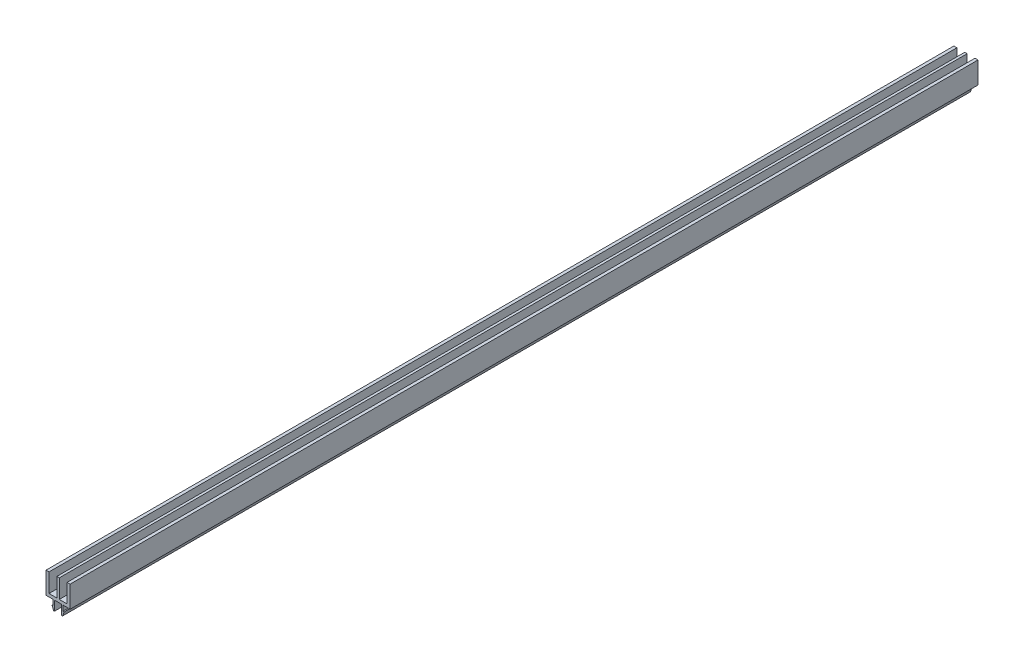
ISO-10303-21;
HEADER;
FILE_DESCRIPTION(('STEP AP214'),'2;1');
FILE_NAME('part.step','',(''),(''),'','','');
FILE_SCHEMA(('AUTOMOTIVE_DESIGN { 1 0 10303 214 1 1 1 1 }'));
ENDSEC;
DATA;
#1=APPLICATION_CONTEXT('core data for automotive mechanical design processes');
#2=APPLICATION_PROTOCOL_DEFINITION('international standard','automotive_design',2000,#1);
#3=PRODUCT_CONTEXT('',#1,'mechanical');
#4=PRODUCT('Part','Part','',(#3));
#5=PRODUCT_RELATED_PRODUCT_CATEGORY('part','',(#4));
#6=PRODUCT_DEFINITION_FORMATION('','',#4);
#7=PRODUCT_DEFINITION_CONTEXT('part definition',#1,'design');
#8=PRODUCT_DEFINITION('design','',#6,#7);
#9=PRODUCT_DEFINITION_SHAPE('','',#8);
#10=(LENGTH_UNIT() NAMED_UNIT(*) SI_UNIT(.MILLI.,.METRE.));
#11=(NAMED_UNIT(*) PLANE_ANGLE_UNIT() SI_UNIT($,.RADIAN.));
#12=(NAMED_UNIT(*) SI_UNIT($,.STERADIAN.) SOLID_ANGLE_UNIT());
#13=UNCERTAINTY_MEASURE_WITH_UNIT(LENGTH_MEASURE(1.E-05),#10,'distance_accuracy_value','');
#14=(GEOMETRIC_REPRESENTATION_CONTEXT(3) GLOBAL_UNCERTAINTY_ASSIGNED_CONTEXT((#13)) GLOBAL_UNIT_ASSIGNED_CONTEXT((#10,
#11,#12)) REPRESENTATION_CONTEXT('',''));
#15=CARTESIAN_POINT('',(0.,0.,0.));
#16=DIRECTION('',(0.,0.,1.));
#17=DIRECTION('',(1.,0.,0.));
#18=AXIS2_PLACEMENT_3D('',#15,#16,#17);
#19=CARTESIAN_POINT('',(-1.,17.9999999975,-702.));
#20=DIRECTION('',(-1.,0.,0.));
#21=DIRECTION('',(0.,-1.,0.));
#22=AXIS2_PLACEMENT_3D('',#19,#20,#21);
#23=PLANE('',#22);
#24=DIRECTION('',(0.,-1.,0.));
#25=VECTOR('',#24,1.);
#26=CARTESIAN_POINT('',(-1.,17.9999999975,50.));
#27=LINE('',#26,#25);
#28=CARTESIAN_POINT('',(-1.,17.9999999975,50.));
#29=VERTEX_POINT('',#28);
#30=CARTESIAN_POINT('',(-1.,2.4999999995,50.));
#31=VERTEX_POINT('',#30);
#32=EDGE_CURVE('E226',#29,#31,#27,.T.);
#33=ORIENTED_EDGE('',*,*,#32,.F.);
#34=DIRECTION('',(0.,0.,1.));
#35=VECTOR('',#34,1.);
#36=CARTESIAN_POINT('',(-1.,17.9999999975,-702.));
#37=LINE('',#36,#35);
#38=CARTESIAN_POINT('',(-1.,17.9999999975,-702.));
#39=VERTEX_POINT('',#38);
#40=EDGE_CURVE('E11',#39,#29,#37,.T.);
#41=ORIENTED_EDGE('',*,*,#40,.F.);
#42=DIRECTION('',(0.,-1.,0.));
#43=VECTOR('',#42,1.);
#44=CARTESIAN_POINT('',(-1.,17.9999999975,-702.));
#45=LINE('',#44,#43);
#46=CARTESIAN_POINT('',(-1.,2.4999999995,-702.));
#47=VERTEX_POINT('',#46);
#48=EDGE_CURVE('E294',#39,#47,#45,.T.);
#49=ORIENTED_EDGE('',*,*,#48,.T.);
#50=DIRECTION('',(0.,0.,1.));
#51=VECTOR('',#50,1.);
#52=CARTESIAN_POINT('',(-1.,2.4999999995,-702.));
#53=LINE('',#52,#51);
#54=EDGE_CURVE('E36',#47,#31,#53,.T.);
#55=ORIENTED_EDGE('',*,*,#54,.T.);
#56=EDGE_LOOP('',(#33,#41,#49,#55));
#57=FACE_BOUND('',#56,.T.);
#58=ADVANCED_FACE('F33',(#57),#23,.T.);
#59=CARTESIAN_POINT('',(0.999999999999998,17.9999999975,-702.));
#60=DIRECTION('',(0.,1.,0.));
#61=DIRECTION('',(0.,0.,1.));
#62=AXIS2_PLACEMENT_3D('',#59,#60,#61);
#63=PLANE('',#62);
#64=DIRECTION('',(-1.,0.,0.));
#65=VECTOR('',#64,1.);
#66=CARTESIAN_POINT('',(0.999999999999998,17.9999999975,50.));
#67=LINE('',#66,#65);
#68=CARTESIAN_POINT('',(0.999999999999998,17.9999999975,50.));
#69=VERTEX_POINT('',#68);
#70=EDGE_CURVE('E292',#69,#29,#67,.T.);
#71=ORIENTED_EDGE('',*,*,#70,.F.);
#72=DIRECTION('',(0.,0.,1.));
#73=VECTOR('',#72,1.);
#74=CARTESIAN_POINT('',(0.999999999999998,17.9999999975,-702.));
#75=LINE('',#74,#73);
#76=CARTESIAN_POINT('',(0.999999999999998,17.9999999975,-702.));
#77=VERTEX_POINT('',#76);
#78=EDGE_CURVE('E42',#77,#69,#75,.T.);
#79=ORIENTED_EDGE('',*,*,#78,.F.);
#80=DIRECTION('',(-1.,0.,0.));
#81=VECTOR('',#80,1.);
#82=CARTESIAN_POINT('',(0.999999999999998,17.9999999975,-702.));
#83=LINE('',#82,#81);
#84=EDGE_CURVE('E216',#77,#39,#83,.T.);
#85=ORIENTED_EDGE('',*,*,#84,.T.);
#86=ORIENTED_EDGE('',*,*,#40,.T.);
#87=EDGE_LOOP('',(#71,#79,#85,#86));
#88=FACE_BOUND('',#87,.T.);
#89=ADVANCED_FACE('F338',(#88),#63,.T.);
#90=CARTESIAN_POINT('',(0.999999999999998,2.4999999995,-702.));
#91=DIRECTION('',(1.,0.,0.));
#92=DIRECTION('',(0.,0.,-1.));
#93=AXIS2_PLACEMENT_3D('',#90,#91,#92);
#94=PLANE('',#93);
#95=DIRECTION('',(0.,1.,0.));
#96=VECTOR('',#95,1.);
#97=CARTESIAN_POINT('',(0.999999999999998,2.4999999995,50.));
#98=LINE('',#97,#96);
#99=CARTESIAN_POINT('',(0.999999999999998,2.4999999995,50.));
#100=VERTEX_POINT('',#99);
#101=EDGE_CURVE('E203',#100,#69,#98,.T.);
#102=ORIENTED_EDGE('',*,*,#101,.F.);
#103=DIRECTION('',(0.,0.,1.));
#104=VECTOR('',#103,1.);
#105=CARTESIAN_POINT('',(0.999999999999998,2.4999999995,-702.));
#106=LINE('',#105,#104);
#107=CARTESIAN_POINT('',(0.999999999999998,2.4999999995,-702.));
#108=VERTEX_POINT('',#107);
#109=EDGE_CURVE('E198',#108,#100,#106,.T.);
#110=ORIENTED_EDGE('',*,*,#109,.F.);
#111=DIRECTION('',(0.,1.,0.));
#112=VECTOR('',#111,1.);
#113=CARTESIAN_POINT('',(0.999999999999998,2.4999999995,-702.));
#114=LINE('',#113,#112);
#115=EDGE_CURVE('E201',#108,#77,#114,.T.);
#116=ORIENTED_EDGE('',*,*,#115,.T.);
#117=ORIENTED_EDGE('',*,*,#78,.T.);
#118=EDGE_LOOP('',(#102,#110,#116,#117));
#119=FACE_BOUND('',#118,.T.);
#120=ADVANCED_FACE('F200',(#119),#94,.T.);
#121=CARTESIAN_POINT('',(7.5,2.4999999995,-702.));
#122=DIRECTION('',(0.,1.,0.));
#123=DIRECTION('',(-1.,0.,0.));
#124=AXIS2_PLACEMENT_3D('',#121,#122,#123);
#125=PLANE('',#124);
#126=DIRECTION('',(-1.,0.,0.));
#127=VECTOR('',#126,1.);
#128=CARTESIAN_POINT('',(7.5,2.4999999995,50.));
#129=LINE('',#128,#127);
#130=CARTESIAN_POINT('',(7.5,2.4999999995,50.));
#131=VERTEX_POINT('',#130);
#132=EDGE_CURVE('E289',#131,#100,#129,.T.);
#133=ORIENTED_EDGE('',*,*,#132,.F.);
#134=DIRECTION('',(0.,0.,1.));
#135=VECTOR('',#134,1.);
#136=CARTESIAN_POINT('',(7.5,2.4999999995,-702.));
#137=LINE('',#136,#135);
#138=CARTESIAN_POINT('',(7.5,2.4999999995,-702.));
#139=VERTEX_POINT('',#138);
#140=EDGE_CURVE('E208',#139,#131,#137,.T.);
#141=ORIENTED_EDGE('',*,*,#140,.F.);
#142=DIRECTION('',(-1.,0.,0.));
#143=VECTOR('',#142,1.);
#144=CARTESIAN_POINT('',(7.5,2.4999999995,-702.));
#145=LINE('',#144,#143);
#146=EDGE_CURVE('E214',#139,#108,#145,.T.);
#147=ORIENTED_EDGE('',*,*,#146,.T.);
#148=ORIENTED_EDGE('',*,*,#109,.T.);
#149=EDGE_LOOP('',(#133,#141,#147,#148));
#150=FACE_BOUND('',#149,.T.);
#151=ADVANCED_FACE('F218',(#150),#125,.T.);
#152=CARTESIAN_POINT('',(7.5,17.9999999975,-702.));
#153=DIRECTION('',(-1.,0.,0.));
#154=DIRECTION('',(0.,-1.,0.));
#155=AXIS2_PLACEMENT_3D('',#152,#153,#154);
#156=PLANE('',#155);
#157=DIRECTION('',(0.,-1.,0.));
#158=VECTOR('',#157,1.);
#159=CARTESIAN_POINT('',(7.5,17.9999999975,50.));
#160=LINE('',#159,#158);
#161=CARTESIAN_POINT('',(7.5,17.9999999975,50.));
#162=VERTEX_POINT('',#161);
#163=EDGE_CURVE('E286',#162,#131,#160,.T.);
#164=ORIENTED_EDGE('',*,*,#163,.F.);
#165=DIRECTION('',(0.,0.,1.));
#166=VECTOR('',#165,1.);
#167=CARTESIAN_POINT('',(7.5,17.9999999975,-702.));
#168=LINE('',#167,#166);
#169=CARTESIAN_POINT('',(7.5,17.9999999975,-702.));
#170=VERTEX_POINT('',#169);
#171=EDGE_CURVE('E298',#170,#162,#168,.T.);
#172=ORIENTED_EDGE('',*,*,#171,.F.);
#173=DIRECTION('',(0.,-1.,0.));
#174=VECTOR('',#173,1.);
#175=CARTESIAN_POINT('',(7.5,17.9999999975,-702.));
#176=LINE('',#175,#174);
#177=EDGE_CURVE('E219',#170,#139,#176,.T.);
#178=ORIENTED_EDGE('',*,*,#177,.T.);
#179=ORIENTED_EDGE('',*,*,#140,.T.);
#180=EDGE_LOOP('',(#164,#172,#178,#179));
#181=FACE_BOUND('',#180,.T.);
#182=ADVANCED_FACE('F351',(#181),#156,.T.);
#183=CARTESIAN_POINT('',(10.,17.9999999975,-702.));
#184=DIRECTION('',(0.,1.,0.));
#185=DIRECTION('',(0.,0.,1.));
#186=AXIS2_PLACEMENT_3D('',#183,#184,#185);
#187=PLANE('',#186);
#188=DIRECTION('',(-1.,0.,0.));
#189=VECTOR('',#188,1.);
#190=CARTESIAN_POINT('',(10.,17.9999999975,50.));
#191=LINE('',#190,#189);
#192=CARTESIAN_POINT('',(10.,17.9999999975,50.));
#193=VERTEX_POINT('',#192);
#194=EDGE_CURVE('E283',#193,#162,#191,.T.);
#195=ORIENTED_EDGE('',*,*,#194,.F.);
#196=DIRECTION('',(0.,0.,1.));
#197=VECTOR('',#196,1.);
#198=CARTESIAN_POINT('',(10.,17.9999999975,-702.));
#199=LINE('',#198,#197);
#200=CARTESIAN_POINT('',(10.,17.9999999975,-702.));
#201=VERTEX_POINT('',#200);
#202=EDGE_CURVE('E300',#201,#193,#199,.T.);
#203=ORIENTED_EDGE('',*,*,#202,.F.);
#204=DIRECTION('',(-1.,0.,0.));
#205=VECTOR('',#204,1.);
#206=CARTESIAN_POINT('',(10.,17.9999999975,-702.));
#207=LINE('',#206,#205);
#208=EDGE_CURVE('E221',#201,#170,#207,.T.);
#209=ORIENTED_EDGE('',*,*,#208,.T.);
#210=ORIENTED_EDGE('',*,*,#171,.T.);
#211=EDGE_LOOP('',(#195,#203,#209,#210));
#212=FACE_BOUND('',#211,.T.);
#213=ADVANCED_FACE('F354',(#212),#187,.T.);
#214=CARTESIAN_POINT('',(10.,-4.99999828349541E-10,-702.));
#215=DIRECTION('',(1.,0.,0.));
#216=DIRECTION('',(0.,0.,-1.));
#217=AXIS2_PLACEMENT_3D('',#214,#215,#216);
#218=PLANE('',#217);
#219=DIRECTION('',(0.,1.,0.));
#220=VECTOR('',#219,1.);
#221=CARTESIAN_POINT('',(10.,-4.99999828349541E-10,50.));
#222=LINE('',#221,#220);
#223=CARTESIAN_POINT('',(10.,-4.99999828349541E-10,50.));
#224=VERTEX_POINT('',#223);
#225=EDGE_CURVE('E280',#224,#193,#222,.T.);
#226=ORIENTED_EDGE('',*,*,#225,.F.);
#227=DIRECTION('',(0.,0.,1.));
#228=VECTOR('',#227,1.);
#229=CARTESIAN_POINT('',(10.,-4.99999828349541E-10,-702.));
#230=LINE('',#229,#228);
#231=CARTESIAN_POINT('',(10.,-4.99999828349541E-10,-702.));
#232=VERTEX_POINT('',#231);
#233=EDGE_CURVE('E302',#232,#224,#230,.T.);
#234=ORIENTED_EDGE('',*,*,#233,.F.);
#235=DIRECTION('',(0.,1.,0.));
#236=VECTOR('',#235,1.);
#237=CARTESIAN_POINT('',(10.,-4.99999828349541E-10,-702.));
#238=LINE('',#237,#236);
#239=EDGE_CURVE('E644',#232,#201,#238,.T.);
#240=ORIENTED_EDGE('',*,*,#239,.T.);
#241=ORIENTED_EDGE('',*,*,#202,.T.);
#242=EDGE_LOOP('',(#226,#234,#240,#241));
#243=FACE_BOUND('',#242,.T.);
#244=ADVANCED_FACE('F358',(#243),#218,.T.);
#245=CARTESIAN_POINT('',(4.,-4.99999998002099E-10,-702.));
#246=DIRECTION('',(0.,-1.,0.));
#247=DIRECTION('',(1.,0.,0.));
#248=AXIS2_PLACEMENT_3D('',#245,#246,#247);
#249=PLANE('',#248);
#250=DIRECTION('',(1.,0.,0.));
#251=VECTOR('',#250,1.);
#252=CARTESIAN_POINT('',(4.,-4.99999998002099E-10,50.));
#253=LINE('',#252,#251);
#254=CARTESIAN_POINT('',(4.,-4.99999998002099E-10,50.));
#255=VERTEX_POINT('',#254);
#256=EDGE_CURVE('E277',#255,#224,#253,.T.);
#257=ORIENTED_EDGE('',*,*,#256,.F.);
#258=DIRECTION('',(0.,0.,1.));
#259=VECTOR('',#258,1.);
#260=CARTESIAN_POINT('',(4.,-4.99999998002099E-10,-702.));
#261=LINE('',#260,#259);
#262=CARTESIAN_POINT('',(4.,-4.99999998002099E-10,-702.));
#263=VERTEX_POINT('',#262);
#264=EDGE_CURVE('E304',#263,#255,#261,.T.);
#265=ORIENTED_EDGE('',*,*,#264,.F.);
#266=DIRECTION('',(1.,0.,0.));
#267=VECTOR('',#266,1.);
#268=CARTESIAN_POINT('',(4.,-4.99999998002099E-10,-702.));
#269=LINE('',#268,#267);
#270=EDGE_CURVE('E648',#263,#232,#269,.T.);
#271=ORIENTED_EDGE('',*,*,#270,.T.);
#272=ORIENTED_EDGE('',*,*,#233,.T.);
#273=EDGE_LOOP('',(#257,#265,#271,#272));
#274=FACE_BOUND('',#273,.T.);
#275=ADVANCED_FACE('F362',(#274),#249,.T.);
#276=CARTESIAN_POINT('',(4.,-4.5,-702.));
#277=DIRECTION('',(1.,0.,0.));
#278=DIRECTION('',(0.,0.,-1.));
#279=AXIS2_PLACEMENT_3D('',#276,#277,#278);
#280=PLANE('',#279);
#281=DIRECTION('',(0.,1.,0.));
#282=VECTOR('',#281,1.);
#283=CARTESIAN_POINT('',(4.,-4.5,50.));
#284=LINE('',#283,#282);
#285=CARTESIAN_POINT('',(4.,-4.5,50.));
#286=VERTEX_POINT('',#285);
#287=EDGE_CURVE('E274',#286,#255,#284,.T.);
#288=ORIENTED_EDGE('',*,*,#287,.F.);
#289=DIRECTION('',(0.,0.,1.));
#290=VECTOR('',#289,1.);
#291=CARTESIAN_POINT('',(4.,-4.5,-702.));
#292=LINE('',#291,#290);
#293=CARTESIAN_POINT('',(4.,-4.5,-702.));
#294=VERTEX_POINT('',#293);
#295=EDGE_CURVE('E306',#294,#286,#292,.T.);
#296=ORIENTED_EDGE('',*,*,#295,.F.);
#297=DIRECTION('',(0.,1.,0.));
#298=VECTOR('',#297,1.);
#299=CARTESIAN_POINT('',(4.,-4.5,-702.));
#300=LINE('',#299,#298);
#301=EDGE_CURVE('E637',#294,#263,#300,.T.);
#302=ORIENTED_EDGE('',*,*,#301,.T.);
#303=ORIENTED_EDGE('',*,*,#264,.T.);
#304=EDGE_LOOP('',(#288,#296,#302,#303));
#305=FACE_BOUND('',#304,.T.);
#306=ADVANCED_FACE('F366',(#305),#280,.T.);
#307=CARTESIAN_POINT('',(5.,-4.5,-702.));
#308=DIRECTION('',(0.,1.,0.));
#309=DIRECTION('',(0.,0.,1.));
#310=AXIS2_PLACEMENT_3D('',#307,#308,#309);
#311=PLANE('',#310);
#312=DIRECTION('',(-1.,0.,0.));
#313=VECTOR('',#312,1.);
#314=CARTESIAN_POINT('',(5.,-4.5,50.));
#315=LINE('',#314,#313);
#316=CARTESIAN_POINT('',(5.,-4.5,50.));
#317=VERTEX_POINT('',#316);
#318=EDGE_CURVE('E271',#317,#286,#315,.T.);
#319=ORIENTED_EDGE('',*,*,#318,.F.);
#320=DIRECTION('',(0.,0.,1.));
#321=VECTOR('',#320,1.);
#322=CARTESIAN_POINT('',(5.,-4.5,-702.));
#323=LINE('',#322,#321);
#324=CARTESIAN_POINT('',(5.,-4.5,-702.));
#325=VERTEX_POINT('',#324);
#326=EDGE_CURVE('E308',#325,#317,#323,.T.);
#327=ORIENTED_EDGE('',*,*,#326,.F.);
#328=DIRECTION('',(-1.,0.,0.));
#329=VECTOR('',#328,1.);
#330=CARTESIAN_POINT('',(5.,-4.5,-702.));
#331=LINE('',#330,#329);
#332=EDGE_CURVE('E633',#325,#294,#331,.T.);
#333=ORIENTED_EDGE('',*,*,#332,.T.);
#334=ORIENTED_EDGE('',*,*,#295,.T.);
#335=EDGE_LOOP('',(#319,#327,#333,#334));
#336=FACE_BOUND('',#335,.T.);
#337=ADVANCED_FACE('F370',(#336),#311,.T.);
#338=CARTESIAN_POINT('',(3.75,-8.,-702.));
#339=DIRECTION('',(0.941741911594837,-0.336336396998156,0.));
#340=DIRECTION('',(0.336336396998157,0.941741911594838,0.));
#341=AXIS2_PLACEMENT_3D('',#338,#339,#340);
#342=PLANE('',#341);
#343=DIRECTION('',(0.336336396998157,0.941741911594837,0.));
#344=VECTOR('',#343,1.);
#345=CARTESIAN_POINT('',(3.75,-8.,50.));
#346=LINE('',#345,#344);
#347=CARTESIAN_POINT('',(3.75,-8.,50.));
#348=VERTEX_POINT('',#347);
#349=EDGE_CURVE('E268',#348,#317,#346,.T.);
#350=ORIENTED_EDGE('',*,*,#349,.F.);
#351=DIRECTION('',(0.,0.,1.));
#352=VECTOR('',#351,1.);
#353=CARTESIAN_POINT('',(3.75,-8.,-702.));
#354=LINE('',#353,#352);
#355=CARTESIAN_POINT('',(3.75,-8.,-702.));
#356=VERTEX_POINT('',#355);
#357=EDGE_CURVE('E310',#356,#348,#354,.T.);
#358=ORIENTED_EDGE('',*,*,#357,.F.);
#359=DIRECTION('',(0.336336396998157,0.941741911594837,0.));
#360=VECTOR('',#359,1.);
#361=CARTESIAN_POINT('',(3.75,-8.,-702.));
#362=LINE('',#361,#360);
#363=EDGE_CURVE('E654',#356,#325,#362,.T.);
#364=ORIENTED_EDGE('',*,*,#363,.T.);
#365=ORIENTED_EDGE('',*,*,#326,.T.);
#366=EDGE_LOOP('',(#350,#358,#364,#365));
#367=FACE_BOUND('',#366,.T.);
#368=ADVANCED_FACE('F374',(#367),#342,.T.);
#369=CARTESIAN_POINT('',(3.,-8.,-702.));
#370=DIRECTION('',(0.,-1.,0.));
#371=DIRECTION('',(0.,0.,-1.));
#372=AXIS2_PLACEMENT_3D('',#369,#370,#371);
#373=PLANE('',#372);
#374=DIRECTION('',(1.,0.,0.));
#375=VECTOR('',#374,1.);
#376=CARTESIAN_POINT('',(3.,-8.,50.));
#377=LINE('',#376,#375);
#378=CARTESIAN_POINT('',(3.,-8.,50.));
#379=VERTEX_POINT('',#378);
#380=EDGE_CURVE('E265',#379,#348,#377,.T.);
#381=ORIENTED_EDGE('',*,*,#380,.F.);
#382=DIRECTION('',(0.,0.,1.));
#383=VECTOR('',#382,1.);
#384=CARTESIAN_POINT('',(3.,-8.,-702.));
#385=LINE('',#384,#383);
#386=CARTESIAN_POINT('',(3.,-8.,-702.));
#387=VERTEX_POINT('',#386);
#388=EDGE_CURVE('E312',#387,#379,#385,.T.);
#389=ORIENTED_EDGE('',*,*,#388,.F.);
#390=DIRECTION('',(1.,0.,0.));
#391=VECTOR('',#390,1.);
#392=CARTESIAN_POINT('',(3.,-8.,-702.));
#393=LINE('',#392,#391);
#394=EDGE_CURVE('E626',#387,#356,#393,.T.);
#395=ORIENTED_EDGE('',*,*,#394,.T.);
#396=ORIENTED_EDGE('',*,*,#357,.T.);
#397=EDGE_LOOP('',(#381,#389,#395,#396));
#398=FACE_BOUND('',#397,.T.);
#399=ADVANCED_FACE('F378',(#398),#373,.T.);
#400=CARTESIAN_POINT('',(3.,-4.9999985194348E-10,-702.));
#401=DIRECTION('',(-1.,0.,0.));
#402=DIRECTION('',(0.,0.,1.));
#403=AXIS2_PLACEMENT_3D('',#400,#401,#402);
#404=PLANE('',#403);
#405=DIRECTION('',(0.,-1.,0.));
#406=VECTOR('',#405,1.);
#407=CARTESIAN_POINT('',(3.,-4.9999985194348E-10,50.));
#408=LINE('',#407,#406);
#409=CARTESIAN_POINT('',(3.,-4.9999985194348E-10,50.));
#410=VERTEX_POINT('',#409);
#411=EDGE_CURVE('E262',#410,#379,#408,.T.);
#412=ORIENTED_EDGE('',*,*,#411,.F.);
#413=DIRECTION('',(0.,0.,1.));
#414=VECTOR('',#413,1.);
#415=CARTESIAN_POINT('',(3.,-4.9999985194348E-10,-702.));
#416=LINE('',#415,#414);
#417=CARTESIAN_POINT('',(3.,-4.9999985194348E-10,-702.));
#418=VERTEX_POINT('',#417);
#419=EDGE_CURVE('E314',#418,#410,#416,.T.);
#420=ORIENTED_EDGE('',*,*,#419,.F.);
#421=DIRECTION('',(0.,-1.,0.));
#422=VECTOR('',#421,1.);
#423=CARTESIAN_POINT('',(3.,-4.9999985194348E-10,-702.));
#424=LINE('',#423,#422);
#425=EDGE_CURVE('E622',#418,#387,#424,.T.);
#426=ORIENTED_EDGE('',*,*,#425,.T.);
#427=ORIENTED_EDGE('',*,*,#388,.T.);
#428=EDGE_LOOP('',(#412,#420,#426,#427));
#429=FACE_BOUND('',#428,.T.);
#430=ADVANCED_FACE('F382',(#429),#404,.T.);
#431=CARTESIAN_POINT('',(-3.,-4.99999455901012E-10,-702.));
#432=DIRECTION('',(0.,-1.,0.));
#433=DIRECTION('',(1.,0.,0.));
#434=AXIS2_PLACEMENT_3D('',#431,#432,#433);
#435=PLANE('',#434);
#436=DIRECTION('',(1.,0.,0.));
#437=VECTOR('',#436,1.);
#438=CARTESIAN_POINT('',(-3.,-4.99999455901012E-10,50.));
#439=LINE('',#438,#437);
#440=CARTESIAN_POINT('',(-3.,-4.99999455901012E-10,50.));
#441=VERTEX_POINT('',#440);
#442=EDGE_CURVE('E259',#441,#410,#439,.T.);
#443=ORIENTED_EDGE('',*,*,#442,.F.);
#444=DIRECTION('',(0.,0.,1.));
#445=VECTOR('',#444,1.);
#446=CARTESIAN_POINT('',(-3.,-4.99999455901012E-10,-702.));
#447=LINE('',#446,#445);
#448=CARTESIAN_POINT('',(-3.,-4.99999455901012E-10,-702.));
#449=VERTEX_POINT('',#448);
#450=EDGE_CURVE('E316',#449,#441,#447,.T.);
#451=ORIENTED_EDGE('',*,*,#450,.F.);
#452=DIRECTION('',(1.,0.,0.));
#453=VECTOR('',#452,1.);
#454=CARTESIAN_POINT('',(-3.,-4.99999455901012E-10,-702.));
#455=LINE('',#454,#453);
#456=EDGE_CURVE('E658',#449,#418,#455,.T.);
#457=ORIENTED_EDGE('',*,*,#456,.T.);
#458=ORIENTED_EDGE('',*,*,#419,.T.);
#459=EDGE_LOOP('',(#443,#451,#457,#458));
#460=FACE_BOUND('',#459,.T.);
#461=ADVANCED_FACE('F386',(#460),#435,.T.);
#462=CARTESIAN_POINT('',(-3.,-8.,-702.));
#463=DIRECTION('',(1.,0.,0.));
#464=DIRECTION('',(0.,0.,-1.));
#465=AXIS2_PLACEMENT_3D('',#462,#463,#464);
#466=PLANE('',#465);
#467=DIRECTION('',(0.,1.,0.));
#468=VECTOR('',#467,1.);
#469=CARTESIAN_POINT('',(-3.,-8.,50.));
#470=LINE('',#469,#468);
#471=CARTESIAN_POINT('',(-3.,-8.,50.));
#472=VERTEX_POINT('',#471);
#473=EDGE_CURVE('E256',#472,#441,#470,.T.);
#474=ORIENTED_EDGE('',*,*,#473,.F.);
#475=DIRECTION('',(0.,0.,1.));
#476=VECTOR('',#475,1.);
#477=CARTESIAN_POINT('',(-3.,-8.,-702.));
#478=LINE('',#477,#476);
#479=CARTESIAN_POINT('',(-3.,-8.,-702.));
#480=VERTEX_POINT('',#479);
#481=EDGE_CURVE('E318',#480,#472,#478,.T.);
#482=ORIENTED_EDGE('',*,*,#481,.F.);
#483=DIRECTION('',(0.,1.,0.));
#484=VECTOR('',#483,1.);
#485=CARTESIAN_POINT('',(-3.,-8.,-702.));
#486=LINE('',#485,#484);
#487=EDGE_CURVE('E615',#480,#449,#486,.T.);
#488=ORIENTED_EDGE('',*,*,#487,.T.);
#489=ORIENTED_EDGE('',*,*,#450,.T.);
#490=EDGE_LOOP('',(#474,#482,#488,#489));
#491=FACE_BOUND('',#490,.T.);
#492=ADVANCED_FACE('F390',(#491),#466,.T.);
#493=CARTESIAN_POINT('',(-3.75,-8.,-702.));
#494=DIRECTION('',(0.,-1.,0.));
#495=DIRECTION('',(0.,0.,-1.));
#496=AXIS2_PLACEMENT_3D('',#493,#494,#495);
#497=PLANE('',#496);
#498=DIRECTION('',(1.,0.,0.));
#499=VECTOR('',#498,1.);
#500=CARTESIAN_POINT('',(-3.75,-8.,50.));
#501=LINE('',#500,#499);
#502=CARTESIAN_POINT('',(-3.75,-8.,50.));
#503=VERTEX_POINT('',#502);
#504=EDGE_CURVE('E253',#503,#472,#501,.T.);
#505=ORIENTED_EDGE('',*,*,#504,.F.);
#506=DIRECTION('',(0.,0.,1.));
#507=VECTOR('',#506,1.);
#508=CARTESIAN_POINT('',(-3.75,-8.,-702.));
#509=LINE('',#508,#507);
#510=CARTESIAN_POINT('',(-3.75,-8.,-702.));
#511=VERTEX_POINT('',#510);
#512=EDGE_CURVE('E320',#511,#503,#509,.T.);
#513=ORIENTED_EDGE('',*,*,#512,.F.);
#514=DIRECTION('',(1.,0.,0.));
#515=VECTOR('',#514,1.);
#516=CARTESIAN_POINT('',(-3.75,-8.,-702.));
#517=LINE('',#516,#515);
#518=EDGE_CURVE('E611',#511,#480,#517,.T.);
#519=ORIENTED_EDGE('',*,*,#518,.T.);
#520=ORIENTED_EDGE('',*,*,#481,.T.);
#521=EDGE_LOOP('',(#505,#513,#519,#520));
#522=FACE_BOUND('',#521,.T.);
#523=ADVANCED_FACE('F394',(#522),#497,.T.);
#524=CARTESIAN_POINT('',(-5.,-4.5,-702.));
#525=DIRECTION('',(-0.941741911594837,-0.336336396998156,0.));
#526=DIRECTION('',(0.336336396998156,-0.941741911594838,0.));
#527=AXIS2_PLACEMENT_3D('',#524,#525,#526);
#528=PLANE('',#527);
#529=DIRECTION('',(0.336336396998156,-0.941741911594837,0.));
#530=VECTOR('',#529,1.);
#531=CARTESIAN_POINT('',(-5.,-4.5,50.));
#532=LINE('',#531,#530);
#533=CARTESIAN_POINT('',(-5.,-4.5,50.));
#534=VERTEX_POINT('',#533);
#535=EDGE_CURVE('E250',#534,#503,#532,.T.);
#536=ORIENTED_EDGE('',*,*,#535,.F.);
#537=DIRECTION('',(0.,0.,1.));
#538=VECTOR('',#537,1.);
#539=CARTESIAN_POINT('',(-5.,-4.5,-702.));
#540=LINE('',#539,#538);
#541=CARTESIAN_POINT('',(-5.,-4.5,-702.));
#542=VERTEX_POINT('',#541);
#543=EDGE_CURVE('E322',#542,#534,#540,.T.);
#544=ORIENTED_EDGE('',*,*,#543,.F.);
#545=DIRECTION('',(0.336336396998156,-0.941741911594837,0.));
#546=VECTOR('',#545,1.);
#547=CARTESIAN_POINT('',(-5.,-4.5,-702.));
#548=LINE('',#547,#546);
#549=EDGE_CURVE('E662',#542,#511,#548,.T.);
#550=ORIENTED_EDGE('',*,*,#549,.T.);
#551=ORIENTED_EDGE('',*,*,#512,.T.);
#552=EDGE_LOOP('',(#536,#544,#550,#551));
#553=FACE_BOUND('',#552,.T.);
#554=ADVANCED_FACE('F398',(#553),#528,.T.);
#555=CARTESIAN_POINT('',(-4.,-4.5,-702.));
#556=DIRECTION('',(0.,1.,0.));
#557=DIRECTION('',(0.,0.,1.));
#558=AXIS2_PLACEMENT_3D('',#555,#556,#557);
#559=PLANE('',#558);
#560=DIRECTION('',(-1.,0.,0.));
#561=VECTOR('',#560,1.);
#562=CARTESIAN_POINT('',(-4.,-4.5,50.));
#563=LINE('',#562,#561);
#564=CARTESIAN_POINT('',(-4.,-4.5,50.));
#565=VERTEX_POINT('',#564);
#566=EDGE_CURVE('E247',#565,#534,#563,.T.);
#567=ORIENTED_EDGE('',*,*,#566,.F.);
#568=DIRECTION('',(0.,0.,1.));
#569=VECTOR('',#568,1.);
#570=CARTESIAN_POINT('',(-4.,-4.5,-702.));
#571=LINE('',#570,#569);
#572=CARTESIAN_POINT('',(-4.,-4.5,-702.));
#573=VERTEX_POINT('',#572);
#574=EDGE_CURVE('E324',#573,#565,#571,.T.);
#575=ORIENTED_EDGE('',*,*,#574,.F.);
#576=DIRECTION('',(-1.,0.,0.));
#577=VECTOR('',#576,1.);
#578=CARTESIAN_POINT('',(-4.,-4.5,-702.));
#579=LINE('',#578,#577);
#580=EDGE_CURVE('E604',#573,#542,#579,.T.);
#581=ORIENTED_EDGE('',*,*,#580,.T.);
#582=ORIENTED_EDGE('',*,*,#543,.T.);
#583=EDGE_LOOP('',(#567,#575,#581,#582));
#584=FACE_BOUND('',#583,.T.);
#585=ADVANCED_FACE('F402',(#584),#559,.T.);
#586=CARTESIAN_POINT('',(-4.,-4.9999985194348E-10,-702.));
#587=DIRECTION('',(-1.,0.,0.));
#588=DIRECTION('',(0.,0.,1.));
#589=AXIS2_PLACEMENT_3D('',#586,#587,#588);
#590=PLANE('',#589);
#591=DIRECTION('',(0.,-1.,0.));
#592=VECTOR('',#591,1.);
#593=CARTESIAN_POINT('',(-4.,-4.9999985194348E-10,50.));
#594=LINE('',#593,#592);
#595=CARTESIAN_POINT('',(-4.,-4.9999985194348E-10,50.));
#596=VERTEX_POINT('',#595);
#597=EDGE_CURVE('E244',#596,#565,#594,.T.);
#598=ORIENTED_EDGE('',*,*,#597,.F.);
#599=DIRECTION('',(0.,0.,1.));
#600=VECTOR('',#599,1.);
#601=CARTESIAN_POINT('',(-4.,-4.9999985194348E-10,-702.));
#602=LINE('',#601,#600);
#603=CARTESIAN_POINT('',(-4.,-4.9999985194348E-10,-702.));
#604=VERTEX_POINT('',#603);
#605=EDGE_CURVE('E326',#604,#596,#602,.T.);
#606=ORIENTED_EDGE('',*,*,#605,.F.);
#607=DIRECTION('',(0.,-1.,0.));
#608=VECTOR('',#607,1.);
#609=CARTESIAN_POINT('',(-4.,-4.9999985194348E-10,-702.));
#610=LINE('',#609,#608);
#611=EDGE_CURVE('E600',#604,#573,#610,.T.);
#612=ORIENTED_EDGE('',*,*,#611,.T.);
#613=ORIENTED_EDGE('',*,*,#574,.T.);
#614=EDGE_LOOP('',(#598,#606,#612,#613));
#615=FACE_BOUND('',#614,.T.);
#616=ADVANCED_FACE('F406',(#615),#590,.T.);
#617=CARTESIAN_POINT('',(-10.,-4.99999719929324E-10,-702.));
#618=DIRECTION('',(0.,-1.,0.));
#619=DIRECTION('',(1.,0.,0.));
#620=AXIS2_PLACEMENT_3D('',#617,#618,#619);
#621=PLANE('',#620);
#622=DIRECTION('',(1.,0.,0.));
#623=VECTOR('',#622,1.);
#624=CARTESIAN_POINT('',(-10.,-4.99999719929324E-10,50.));
#625=LINE('',#624,#623);
#626=CARTESIAN_POINT('',(-10.,-4.99999719929324E-10,50.));
#627=VERTEX_POINT('',#626);
#628=EDGE_CURVE('E241',#627,#596,#625,.T.);
#629=ORIENTED_EDGE('',*,*,#628,.F.);
#630=DIRECTION('',(0.,0.,1.));
#631=VECTOR('',#630,1.);
#632=CARTESIAN_POINT('',(-10.,-4.99999719929324E-10,-702.));
#633=LINE('',#632,#631);
#634=CARTESIAN_POINT('',(-10.,-4.99999719929324E-10,-702.));
#635=VERTEX_POINT('',#634);
#636=EDGE_CURVE('E328',#635,#627,#633,.T.);
#637=ORIENTED_EDGE('',*,*,#636,.F.);
#638=DIRECTION('',(1.,0.,0.));
#639=VECTOR('',#638,1.);
#640=CARTESIAN_POINT('',(-10.,-4.99999719929324E-10,-702.));
#641=LINE('',#640,#639);
#642=EDGE_CURVE('E666',#635,#604,#641,.T.);
#643=ORIENTED_EDGE('',*,*,#642,.T.);
#644=ORIENTED_EDGE('',*,*,#605,.T.);
#645=EDGE_LOOP('',(#629,#637,#643,#644));
#646=FACE_BOUND('',#645,.T.);
#647=ADVANCED_FACE('F410',(#646),#621,.T.);
#648=CARTESIAN_POINT('',(-10.,17.9999999975,-702.));
#649=DIRECTION('',(-1.,0.,0.));
#650=DIRECTION('',(0.,-1.,0.));
#651=AXIS2_PLACEMENT_3D('',#648,#649,#650);
#652=PLANE('',#651);
#653=DIRECTION('',(0.,-1.,0.));
#654=VECTOR('',#653,1.);
#655=CARTESIAN_POINT('',(-10.,17.9999999975,50.));
#656=LINE('',#655,#654);
#657=CARTESIAN_POINT('',(-10.,17.9999999975,50.));
#658=VERTEX_POINT('',#657);
#659=EDGE_CURVE('E238',#658,#627,#656,.T.);
#660=ORIENTED_EDGE('',*,*,#659,.F.);
#661=DIRECTION('',(0.,0.,1.));
#662=VECTOR('',#661,1.);
#663=CARTESIAN_POINT('',(-10.,17.9999999975,-702.));
#664=LINE('',#663,#662);
#665=CARTESIAN_POINT('',(-10.,17.9999999975,-702.));
#666=VERTEX_POINT('',#665);
#667=EDGE_CURVE('E330',#666,#658,#664,.T.);
#668=ORIENTED_EDGE('',*,*,#667,.F.);
#669=DIRECTION('',(0.,-1.,0.));
#670=VECTOR('',#669,1.);
#671=CARTESIAN_POINT('',(-10.,17.9999999975,-702.));
#672=LINE('',#671,#670);
#673=EDGE_CURVE('E593',#666,#635,#672,.T.);
#674=ORIENTED_EDGE('',*,*,#673,.T.);
#675=ORIENTED_EDGE('',*,*,#636,.T.);
#676=EDGE_LOOP('',(#660,#668,#674,#675));
#677=FACE_BOUND('',#676,.T.);
#678=ADVANCED_FACE('F414',(#677),#652,.T.);
#679=CARTESIAN_POINT('',(-7.5,17.9999999975,-702.));
#680=DIRECTION('',(0.,1.,0.));
#681=DIRECTION('',(0.,0.,1.));
#682=AXIS2_PLACEMENT_3D('',#679,#680,#681);
#683=PLANE('',#682);
#684=DIRECTION('',(-1.,0.,0.));
#685=VECTOR('',#684,1.);
#686=CARTESIAN_POINT('',(-7.5,17.9999999975,50.));
#687=LINE('',#686,#685);
#688=CARTESIAN_POINT('',(-7.5,17.9999999975,50.));
#689=VERTEX_POINT('',#688);
#690=EDGE_CURVE('E235',#689,#658,#687,.T.);
#691=ORIENTED_EDGE('',*,*,#690,.F.);
#692=DIRECTION('',(0.,0.,1.));
#693=VECTOR('',#692,1.);
#694=CARTESIAN_POINT('',(-7.5,17.9999999975,-702.));
#695=LINE('',#694,#693);
#696=CARTESIAN_POINT('',(-7.5,17.9999999975,-702.));
#697=VERTEX_POINT('',#696);
#698=EDGE_CURVE('E332',#697,#689,#695,.T.);
#699=ORIENTED_EDGE('',*,*,#698,.F.);
#700=DIRECTION('',(-1.,0.,0.));
#701=VECTOR('',#700,1.);
#702=CARTESIAN_POINT('',(-7.5,17.9999999975,-702.));
#703=LINE('',#702,#701);
#704=EDGE_CURVE('E589',#697,#666,#703,.T.);
#705=ORIENTED_EDGE('',*,*,#704,.T.);
#706=ORIENTED_EDGE('',*,*,#667,.T.);
#707=EDGE_LOOP('',(#691,#699,#705,#706));
#708=FACE_BOUND('',#707,.T.);
#709=ADVANCED_FACE('F418',(#708),#683,.T.);
#710=CARTESIAN_POINT('',(-7.5,2.4999999995,-702.));
#711=DIRECTION('',(1.,0.,0.));
#712=DIRECTION('',(0.,0.,-1.));
#713=AXIS2_PLACEMENT_3D('',#710,#711,#712);
#714=PLANE('',#713);
#715=DIRECTION('',(0.,1.,0.));
#716=VECTOR('',#715,1.);
#717=CARTESIAN_POINT('',(-7.5,2.4999999995,50.));
#718=LINE('',#717,#716);
#719=CARTESIAN_POINT('',(-7.5,2.4999999995,50.));
#720=VERTEX_POINT('',#719);
#721=EDGE_CURVE('E232',#720,#689,#718,.T.);
#722=ORIENTED_EDGE('',*,*,#721,.F.);
#723=DIRECTION('',(0.,0.,1.));
#724=VECTOR('',#723,1.);
#725=CARTESIAN_POINT('',(-7.5,2.4999999995,-702.));
#726=LINE('',#725,#724);
#727=CARTESIAN_POINT('',(-7.5,2.4999999995,-702.));
#728=VERTEX_POINT('',#727);
#729=EDGE_CURVE('E333',#728,#720,#726,.T.);
#730=ORIENTED_EDGE('',*,*,#729,.F.);
#731=DIRECTION('',(0.,1.,0.));
#732=VECTOR('',#731,1.);
#733=CARTESIAN_POINT('',(-7.5,2.4999999995,-702.));
#734=LINE('',#733,#732);
#735=EDGE_CURVE('E670',#728,#697,#734,.T.);
#736=ORIENTED_EDGE('',*,*,#735,.T.);
#737=ORIENTED_EDGE('',*,*,#698,.T.);
#738=EDGE_LOOP('',(#722,#730,#736,#737));
#739=FACE_BOUND('',#738,.T.);
#740=ADVANCED_FACE('F422',(#739),#714,.T.);
#741=CARTESIAN_POINT('',(-1.,2.4999999995,-702.));
#742=DIRECTION('',(0.,1.,0.));
#743=DIRECTION('',(-1.,0.,0.));
#744=AXIS2_PLACEMENT_3D('',#741,#742,#743);
#745=PLANE('',#744);
#746=DIRECTION('',(-1.,0.,0.));
#747=VECTOR('',#746,1.);
#748=CARTESIAN_POINT('',(-1.,2.4999999995,50.));
#749=LINE('',#748,#747);
#750=EDGE_CURVE('E229',#31,#720,#749,.T.);
#751=ORIENTED_EDGE('',*,*,#750,.F.);
#752=ORIENTED_EDGE('',*,*,#54,.F.);
#753=DIRECTION('',(-1.,0.,0.));
#754=VECTOR('',#753,1.);
#755=CARTESIAN_POINT('',(-1.,2.4999999995,-702.));
#756=LINE('',#755,#754);
#757=EDGE_CURVE('E672',#47,#728,#756,.T.);
#758=ORIENTED_EDGE('',*,*,#757,.T.);
#759=ORIENTED_EDGE('',*,*,#729,.T.);
#760=EDGE_LOOP('',(#751,#752,#758,#759));
#761=FACE_BOUND('',#760,.T.);
#762=ADVANCED_FACE('F335',(#761),#745,.T.);
#763=CARTESIAN_POINT('',(0.,0.,-702.));
#764=DIRECTION('',(0.,0.,-1.));
#765=DIRECTION('',(-1.,0.,0.));
#766=AXIS2_PLACEMENT_3D('',#763,#764,#765);
#767=PLANE('',#766);
#768=ORIENTED_EDGE('',*,*,#48,.F.);
#769=ORIENTED_EDGE('',*,*,#84,.F.);
#770=ORIENTED_EDGE('',*,*,#115,.F.);
#771=ORIENTED_EDGE('',*,*,#146,.F.);
#772=ORIENTED_EDGE('',*,*,#177,.F.);
#773=ORIENTED_EDGE('',*,*,#208,.F.);
#774=ORIENTED_EDGE('',*,*,#239,.F.);
#775=ORIENTED_EDGE('',*,*,#270,.F.);
#776=ORIENTED_EDGE('',*,*,#301,.F.);
#777=ORIENTED_EDGE('',*,*,#332,.F.);
#778=ORIENTED_EDGE('',*,*,#363,.F.);
#779=ORIENTED_EDGE('',*,*,#394,.F.);
#780=ORIENTED_EDGE('',*,*,#425,.F.);
#781=ORIENTED_EDGE('',*,*,#456,.F.);
#782=ORIENTED_EDGE('',*,*,#487,.F.);
#783=ORIENTED_EDGE('',*,*,#518,.F.);
#784=ORIENTED_EDGE('',*,*,#549,.F.);
#785=ORIENTED_EDGE('',*,*,#580,.F.);
#786=ORIENTED_EDGE('',*,*,#611,.F.);
#787=ORIENTED_EDGE('',*,*,#642,.F.);
#788=ORIENTED_EDGE('',*,*,#673,.F.);
#789=ORIENTED_EDGE('',*,*,#704,.F.);
#790=ORIENTED_EDGE('',*,*,#735,.F.);
#791=ORIENTED_EDGE('',*,*,#757,.F.);
#792=EDGE_LOOP('',(#768,#769,#770,#771,#772,#773,#774,#775,#776,#777,#778,#779,#780,#781,#782,
#783,#784,#785,#786,#787,#788,#789,#790,#791));
#793=FACE_BOUND('',#792,.T.);
#794=ADVANCED_FACE('F212',(#793),#767,.T.);
#795=CARTESIAN_POINT('',(0.,0.,50.));
#796=DIRECTION('',(0.,0.,-1.));
#797=DIRECTION('',(-1.,0.,0.));
#798=AXIS2_PLACEMENT_3D('',#795,#796,#797);
#799=PLANE('',#798);
#800=ORIENTED_EDGE('',*,*,#32,.T.);
#801=ORIENTED_EDGE('',*,*,#750,.T.);
#802=ORIENTED_EDGE('',*,*,#721,.T.);
#803=ORIENTED_EDGE('',*,*,#690,.T.);
#804=ORIENTED_EDGE('',*,*,#659,.T.);
#805=ORIENTED_EDGE('',*,*,#628,.T.);
#806=ORIENTED_EDGE('',*,*,#597,.T.);
#807=ORIENTED_EDGE('',*,*,#566,.T.);
#808=ORIENTED_EDGE('',*,*,#535,.T.);
#809=ORIENTED_EDGE('',*,*,#504,.T.);
#810=ORIENTED_EDGE('',*,*,#473,.T.);
#811=ORIENTED_EDGE('',*,*,#442,.T.);
#812=ORIENTED_EDGE('',*,*,#411,.T.);
#813=ORIENTED_EDGE('',*,*,#380,.T.);
#814=ORIENTED_EDGE('',*,*,#349,.T.);
#815=ORIENTED_EDGE('',*,*,#318,.T.);
#816=ORIENTED_EDGE('',*,*,#287,.T.);
#817=ORIENTED_EDGE('',*,*,#256,.T.);
#818=ORIENTED_EDGE('',*,*,#225,.T.);
#819=ORIENTED_EDGE('',*,*,#194,.T.);
#820=ORIENTED_EDGE('',*,*,#163,.T.);
#821=ORIENTED_EDGE('',*,*,#132,.T.);
#822=ORIENTED_EDGE('',*,*,#101,.T.);
#823=ORIENTED_EDGE('',*,*,#70,.T.);
#824=EDGE_LOOP('',(#800,#801,#802,#803,#804,#805,#806,#807,#808,#809,#810,#811,#812,#813,#814,
#815,#816,#817,#818,#819,#820,#821,#822,#823));
#825=FACE_BOUND('',#824,.T.);
#826=ADVANCED_FACE('F337',(#825),#799,.F.);
#827=CLOSED_SHELL('',(#58,#89,#120,#151,#182,#213,#244,#275,#306,#337,#368,#399,#430,#461,#492,
#523,#554,#585,#616,#647,#678,#709,#740,#762,#794,#826));
#828=MANIFOLD_SOLID_BREP('B2',#827);
#829=ADVANCED_BREP_SHAPE_REPRESENTATION('',(#18,#828),#14);
#830=SHAPE_DEFINITION_REPRESENTATION(#9,#829);
ENDSEC;
END-ISO-10303-21;
